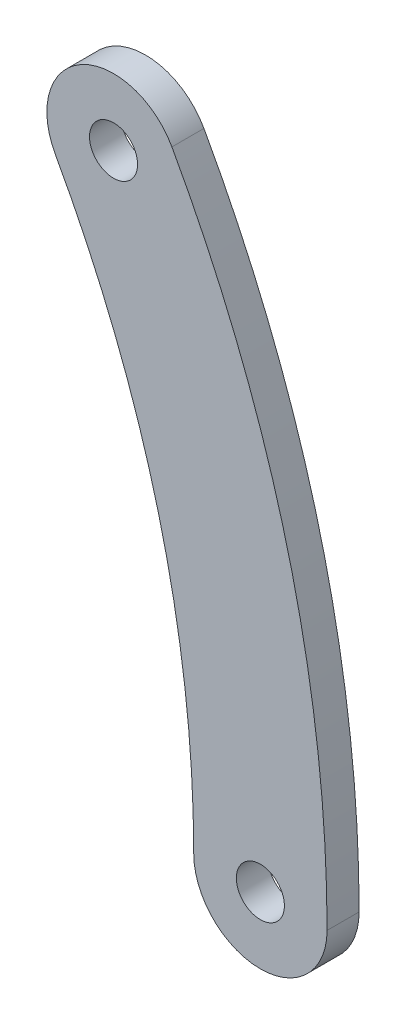
ISO-10303-21;
HEADER;
FILE_DESCRIPTION(('STEP AP214'),'2;1');
FILE_NAME('part.step','',(''),(''),'','','');
FILE_SCHEMA(('AUTOMOTIVE_DESIGN { 1 0 10303 214 1 1 1 1 }'));
ENDSEC;
DATA;
#1=APPLICATION_CONTEXT('core data for automotive mechanical design processes');
#2=APPLICATION_PROTOCOL_DEFINITION('international standard','automotive_design',2000,#1);
#3=PRODUCT_CONTEXT('',#1,'mechanical');
#4=PRODUCT('Part','Part','',(#3));
#5=PRODUCT_RELATED_PRODUCT_CATEGORY('part','',(#4));
#6=PRODUCT_DEFINITION_FORMATION('','',#4);
#7=PRODUCT_DEFINITION_CONTEXT('part definition',#1,'design');
#8=PRODUCT_DEFINITION('design','',#6,#7);
#9=PRODUCT_DEFINITION_SHAPE('','',#8);
#10=(LENGTH_UNIT() NAMED_UNIT(*) SI_UNIT(.MILLI.,.METRE.));
#11=(NAMED_UNIT(*) PLANE_ANGLE_UNIT() SI_UNIT($,.RADIAN.));
#12=(NAMED_UNIT(*) SI_UNIT($,.STERADIAN.) SOLID_ANGLE_UNIT());
#13=UNCERTAINTY_MEASURE_WITH_UNIT(LENGTH_MEASURE(1.E-05),#10,'distance_accuracy_value','');
#14=(GEOMETRIC_REPRESENTATION_CONTEXT(3) GLOBAL_UNCERTAINTY_ASSIGNED_CONTEXT((#13)) GLOBAL_UNIT_ASSIGNED_CONTEXT((#10,
#11,#12)) REPRESENTATION_CONTEXT('',''));
#15=CARTESIAN_POINT('',(0.,0.,0.));
#16=DIRECTION('',(0.,0.,1.));
#17=DIRECTION('',(1.,0.,0.));
#18=AXIS2_PLACEMENT_3D('',#15,#16,#17);
#19=CARTESIAN_POINT('',(110.,0.,3.));
#20=DIRECTION('',(0.,0.,-1.));
#21=DIRECTION('',(-1.,0.,0.));
#22=AXIS2_PLACEMENT_3D('',#19,#20,#21);
#23=CYLINDRICAL_SURFACE('',#22,6.2442631442077);
#24=CARTESIAN_POINT('',(110.,0.,0.));
#25=DIRECTION('',(0.,0.,1.));
#26=DIRECTION('',(1.,0.,0.));
#27=AXIS2_PLACEMENT_3D('',#24,#25,#26);
#28=CIRCLE('',#27,6.2442631442077);
#29=CARTESIAN_POINT('',(103.755736855792,0.,0.));
#30=VERTEX_POINT('',#29);
#31=CARTESIAN_POINT('',(116.244263144208,0.,0.));
#32=VERTEX_POINT('',#31);
#33=EDGE_CURVE('E100',#30,#32,#28,.T.);
#34=ORIENTED_EDGE('',*,*,#33,.T.);
#35=DIRECTION('',(0.,0.,-1.));
#36=VECTOR('',#35,1.);
#37=CARTESIAN_POINT('',(116.244263144208,0.,3.));
#38=LINE('',#37,#36);
#39=CARTESIAN_POINT('',(116.244263144208,0.,3.));
#40=VERTEX_POINT('',#39);
#41=EDGE_CURVE('E11',#40,#32,#38,.T.);
#42=ORIENTED_EDGE('',*,*,#41,.F.);
#43=CARTESIAN_POINT('',(110.,0.,3.));
#44=DIRECTION('',(0.,0.,1.));
#45=DIRECTION('',(1.,0.,0.));
#46=AXIS2_PLACEMENT_3D('',#43,#44,#45);
#47=CIRCLE('',#46,6.2442631442077);
#48=CARTESIAN_POINT('',(103.755736855792,0.,3.));
#49=VERTEX_POINT('',#48);
#50=EDGE_CURVE('E88',#49,#40,#47,.T.);
#51=ORIENTED_EDGE('',*,*,#50,.F.);
#52=DIRECTION('',(0.,0.,-1.));
#53=VECTOR('',#52,1.);
#54=CARTESIAN_POINT('',(103.755736855792,0.,3.));
#55=LINE('',#54,#53);
#56=EDGE_CURVE('E96',#49,#30,#55,.T.);
#57=ORIENTED_EDGE('',*,*,#56,.T.);
#58=EDGE_LOOP('',(#34,#42,#51,#57));
#59=FACE_BOUND('',#58,.T.);
#60=ADVANCED_FACE('F37',(#59),#23,.T.);
#61=CARTESIAN_POINT('',(-2.12330153459561E-12,-5.34294830600857E-13,3.));
#62=DIRECTION('',(0.,0.,-1.));
#63=DIRECTION('',(-1.,0.,0.));
#64=AXIS2_PLACEMENT_3D('',#61,#62,#63);
#65=CYLINDRICAL_SURFACE('',#64,116.24426314421);
#66=CARTESIAN_POINT('',(-2.12330153459561E-12,-5.34294830600857E-13,0.));
#67=DIRECTION('',(0.,0.,1.));
#68=DIRECTION('',(1.,0.,0.));
#69=AXIS2_PLACEMENT_3D('',#66,#67,#68);
#70=CIRCLE('',#69,116.24426314421);
#71=CARTESIAN_POINT('',(101.713730251181,56.2765119062095,0.));
#72=VERTEX_POINT('',#71);
#73=EDGE_CURVE('E92',#32,#72,#70,.T.);
#74=ORIENTED_EDGE('',*,*,#73,.T.);
#75=DIRECTION('',(0.,0.,-1.));
#76=VECTOR('',#75,1.);
#77=CARTESIAN_POINT('',(101.713730251181,56.2765119062095,3.));
#78=LINE('',#77,#76);
#79=CARTESIAN_POINT('',(101.713730251181,56.2765119062095,3.));
#80=VERTEX_POINT('',#79);
#81=EDGE_CURVE('E45',#80,#72,#78,.T.);
#82=ORIENTED_EDGE('',*,*,#81,.F.);
#83=CARTESIAN_POINT('',(-2.12330153459561E-12,-5.34294830600857E-13,3.));
#84=DIRECTION('',(0.,0.,1.));
#85=DIRECTION('',(1.,0.,0.));
#86=AXIS2_PLACEMENT_3D('',#83,#84,#85);
#87=CIRCLE('',#86,116.24426314421);
#88=EDGE_CURVE('E83',#40,#80,#87,.T.);
#89=ORIENTED_EDGE('',*,*,#88,.F.);
#90=ORIENTED_EDGE('',*,*,#41,.T.);
#91=EDGE_LOOP('',(#74,#82,#89,#90));
#92=FACE_BOUND('',#91,.T.);
#93=ADVANCED_FACE('F91',(#92),#65,.T.);
#94=CARTESIAN_POINT('',(96.2499999999995,53.2535210103528,3.));
#95=DIRECTION('',(0.,0.,-1.));
#96=DIRECTION('',(-1.,0.,0.));
#97=AXIS2_PLACEMENT_3D('',#94,#95,#96);
#98=CYLINDRICAL_SURFACE('',#97,6.2442631442077);
#99=CARTESIAN_POINT('',(96.2499999999995,53.2535210103528,0.));
#100=DIRECTION('',(0.,0.,1.));
#101=DIRECTION('',(1.,0.,0.));
#102=AXIS2_PLACEMENT_3D('',#99,#100,#101);
#103=CIRCLE('',#102,6.2442631442077);
#104=CARTESIAN_POINT('',(90.7862697488178,50.2305301144962,0.));
#105=VERTEX_POINT('',#104);
#106=EDGE_CURVE('E70',#72,#105,#103,.T.);
#107=ORIENTED_EDGE('',*,*,#106,.T.);
#108=DIRECTION('',(0.,0.,-1.));
#109=VECTOR('',#108,1.);
#110=CARTESIAN_POINT('',(90.7862697488178,50.2305301144962,3.));
#111=LINE('',#110,#109);
#112=CARTESIAN_POINT('',(90.7862697488178,50.2305301144962,3.));
#113=VERTEX_POINT('',#112);
#114=EDGE_CURVE('E93',#113,#105,#111,.T.);
#115=ORIENTED_EDGE('',*,*,#114,.F.);
#116=CARTESIAN_POINT('',(96.2499999999995,53.2535210103528,3.));
#117=DIRECTION('',(0.,0.,1.));
#118=DIRECTION('',(1.,0.,0.));
#119=AXIS2_PLACEMENT_3D('',#116,#117,#118);
#120=CIRCLE('',#119,6.2442631442077);
#121=EDGE_CURVE('E86',#80,#113,#120,.T.);
#122=ORIENTED_EDGE('',*,*,#121,.F.);
#123=ORIENTED_EDGE('',*,*,#81,.T.);
#124=EDGE_LOOP('',(#107,#115,#122,#123));
#125=FACE_BOUND('',#124,.T.);
#126=ADVANCED_FACE('F94',(#125),#98,.T.);
#127=CARTESIAN_POINT('',(-2.12330153459561E-12,-5.34294830600857E-13,3.));
#128=DIRECTION('',(0.,0.,-1.));
#129=DIRECTION('',(-1.,0.,0.));
#130=AXIS2_PLACEMENT_3D('',#127,#128,#129);
#131=CYLINDRICAL_SURFACE('',#130,103.755736855794);
#132=CARTESIAN_POINT('',(-2.12330153459561E-12,-5.34294830600857E-13,0.));
#133=DIRECTION('',(0.,0.,-1.));
#134=DIRECTION('',(1.,0.,0.));
#135=AXIS2_PLACEMENT_3D('',#132,#133,#134);
#136=CIRCLE('',#135,103.755736855794);
#137=EDGE_CURVE('E76',#105,#30,#136,.T.);
#138=ORIENTED_EDGE('',*,*,#137,.T.);
#139=ORIENTED_EDGE('',*,*,#56,.F.);
#140=CARTESIAN_POINT('',(-2.12330153459561E-12,-5.34294830600857E-13,3.));
#141=DIRECTION('',(0.,0.,-1.));
#142=DIRECTION('',(1.,0.,0.));
#143=AXIS2_PLACEMENT_3D('',#140,#141,#142);
#144=CIRCLE('',#143,103.755736855794);
#145=EDGE_CURVE('E53',#113,#49,#144,.T.);
#146=ORIENTED_EDGE('',*,*,#145,.F.);
#147=ORIENTED_EDGE('',*,*,#114,.T.);
#148=EDGE_LOOP('',(#138,#139,#146,#147));
#149=FACE_BOUND('',#148,.T.);
#150=ADVANCED_FACE('F108',(#149),#131,.F.);
#151=CARTESIAN_POINT('',(54.9999999999989,-2.71727085277002E-13,3.));
#152=DIRECTION('',(0.,0.,1.));
#153=DIRECTION('',(1.,0.,0.));
#154=AXIS2_PLACEMENT_3D('',#151,#152,#153);
#155=PLANE('',#154);
#156=CARTESIAN_POINT('',(110.,0.,3.));
#157=DIRECTION('',(0.,0.,-1.));
#158=DIRECTION('',(-1.,0.,0.));
#159=AXIS2_PLACEMENT_3D('',#156,#157,#158);
#160=CIRCLE('',#159,2.25);
#161=CARTESIAN_POINT('',(107.75,0.,3.));
#162=VERTEX_POINT('',#161);
#163=EDGE_CURVE('E103',#162,#162,#160,.T.);
#164=ORIENTED_EDGE('',*,*,#163,.T.);
#165=EDGE_LOOP('',(#164));
#166=FACE_BOUND('',#165,.T.);
#167=CARTESIAN_POINT('',(96.2499999999995,53.2535210103528,3.));
#168=DIRECTION('',(0.,0.,-1.));
#169=DIRECTION('',(-1.,0.,0.));
#170=AXIS2_PLACEMENT_3D('',#167,#168,#169);
#171=CIRCLE('',#170,2.25);
#172=CARTESIAN_POINT('',(93.9999999999995,53.2535210103528,3.));
#173=VERTEX_POINT('',#172);
#174=EDGE_CURVE('E114',#173,#173,#171,.T.);
#175=ORIENTED_EDGE('',*,*,#174,.T.);
#176=EDGE_LOOP('',(#175));
#177=FACE_BOUND('',#176,.T.);
#178=ORIENTED_EDGE('',*,*,#50,.T.);
#179=ORIENTED_EDGE('',*,*,#88,.T.);
#180=ORIENTED_EDGE('',*,*,#121,.T.);
#181=ORIENTED_EDGE('',*,*,#145,.T.);
#182=EDGE_LOOP('',(#178,#179,#180,#181));
#183=FACE_BOUND('',#182,.T.);
#184=ADVANCED_FACE('F84',(#166,#177,#183),#155,.T.);
#185=CARTESIAN_POINT('',(54.9999999999989,-2.71727085277002E-13,0.));
#186=DIRECTION('',(0.,0.,1.));
#187=DIRECTION('',(1.,0.,0.));
#188=AXIS2_PLACEMENT_3D('',#185,#186,#187);
#189=PLANE('',#188);
#190=CARTESIAN_POINT('',(110.,0.,0.));
#191=DIRECTION('',(0.,0.,-1.));
#192=DIRECTION('',(-1.,0.,0.));
#193=AXIS2_PLACEMENT_3D('',#190,#191,#192);
#194=CIRCLE('',#193,2.25);
#195=CARTESIAN_POINT('',(107.75,0.,0.));
#196=VERTEX_POINT('',#195);
#197=EDGE_CURVE('E120',#196,#196,#194,.T.);
#198=ORIENTED_EDGE('',*,*,#197,.F.);
#199=EDGE_LOOP('',(#198));
#200=FACE_BOUND('',#199,.T.);
#201=CARTESIAN_POINT('',(96.2499999999995,53.2535210103528,0.));
#202=DIRECTION('',(0.,0.,-1.));
#203=DIRECTION('',(-1.,0.,0.));
#204=AXIS2_PLACEMENT_3D('',#201,#202,#203);
#205=CIRCLE('',#204,2.25);
#206=CARTESIAN_POINT('',(93.9999999999995,53.2535210103528,0.));
#207=VERTEX_POINT('',#206);
#208=EDGE_CURVE('E117',#207,#207,#205,.T.);
#209=ORIENTED_EDGE('',*,*,#208,.F.);
#210=EDGE_LOOP('',(#209));
#211=FACE_BOUND('',#210,.T.);
#212=ORIENTED_EDGE('',*,*,#33,.F.);
#213=ORIENTED_EDGE('',*,*,#137,.F.);
#214=ORIENTED_EDGE('',*,*,#106,.F.);
#215=ORIENTED_EDGE('',*,*,#73,.F.);
#216=EDGE_LOOP('',(#212,#213,#214,#215));
#217=FACE_BOUND('',#216,.T.);
#218=ADVANCED_FACE('F111',(#200,#211,#217),#189,.F.);
#219=CARTESIAN_POINT('',(96.2499999999995,53.2535210103528,3.));
#220=DIRECTION('',(0.,0.,-1.));
#221=DIRECTION('',(-1.,0.,0.));
#222=AXIS2_PLACEMENT_3D('',#219,#220,#221);
#223=CYLINDRICAL_SURFACE('',#222,2.25);
#224=ORIENTED_EDGE('',*,*,#174,.F.);
#225=EDGE_LOOP('',(#224));
#226=FACE_BOUND('',#225,.T.);
#227=ORIENTED_EDGE('',*,*,#208,.T.);
#228=EDGE_LOOP('',(#227));
#229=FACE_BOUND('',#228,.T.);
#230=ADVANCED_FACE('F131',(#226,#229),#223,.F.);
#231=CARTESIAN_POINT('',(110.,0.,3.));
#232=DIRECTION('',(0.,0.,-1.));
#233=DIRECTION('',(-1.,0.,0.));
#234=AXIS2_PLACEMENT_3D('',#231,#232,#233);
#235=CYLINDRICAL_SURFACE('',#234,2.25);
#236=ORIENTED_EDGE('',*,*,#163,.F.);
#237=EDGE_LOOP('',(#236));
#238=FACE_BOUND('',#237,.T.);
#239=ORIENTED_EDGE('',*,*,#197,.T.);
#240=EDGE_LOOP('',(#239));
#241=FACE_BOUND('',#240,.T.);
#242=ADVANCED_FACE('F128',(#238,#241),#235,.F.);
#243=CLOSED_SHELL('',(#60,#93,#126,#150,#184,#218,#230,#242));
#244=MANIFOLD_SOLID_BREP('B2',#243);
#245=ADVANCED_BREP_SHAPE_REPRESENTATION('',(#18,#244),#14);
#246=SHAPE_DEFINITION_REPRESENTATION(#9,#245);
ENDSEC;
END-ISO-10303-21;
